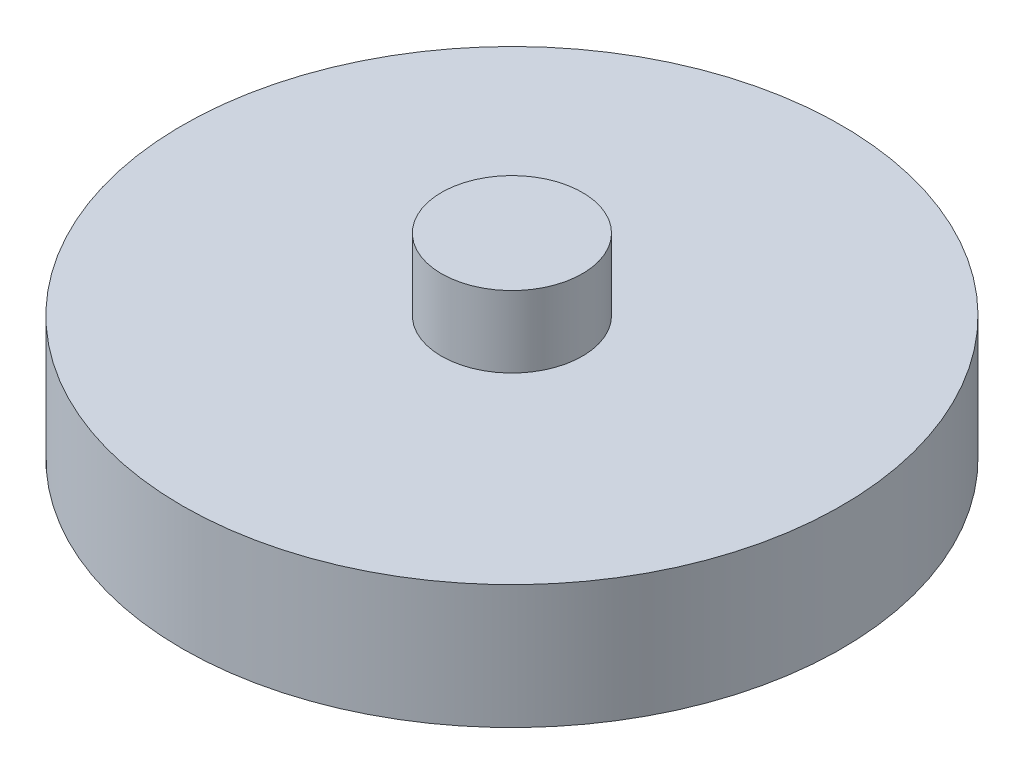
ISO-10303-21;
HEADER;
FILE_DESCRIPTION(('STEP AP214'),'2;1');
FILE_NAME('part.step','',(''),(''),'','','');
FILE_SCHEMA(('AUTOMOTIVE_DESIGN { 1 0 10303 214 1 1 1 1 }'));
ENDSEC;
DATA;
#1=APPLICATION_CONTEXT('core data for automotive mechanical design processes');
#2=APPLICATION_PROTOCOL_DEFINITION('international standard','automotive_design',2000,#1);
#3=PRODUCT_CONTEXT('',#1,'mechanical');
#4=PRODUCT('Part','Part','',(#3));
#5=PRODUCT_RELATED_PRODUCT_CATEGORY('part','',(#4));
#6=PRODUCT_DEFINITION_FORMATION('','',#4);
#7=PRODUCT_DEFINITION_CONTEXT('part definition',#1,'design');
#8=PRODUCT_DEFINITION('design','',#6,#7);
#9=PRODUCT_DEFINITION_SHAPE('','',#8);
#10=(LENGTH_UNIT() NAMED_UNIT(*) SI_UNIT(.MILLI.,.METRE.));
#11=(NAMED_UNIT(*) PLANE_ANGLE_UNIT() SI_UNIT($,.RADIAN.));
#12=(NAMED_UNIT(*) SI_UNIT($,.STERADIAN.) SOLID_ANGLE_UNIT());
#13=UNCERTAINTY_MEASURE_WITH_UNIT(LENGTH_MEASURE(1.E-05),#10,'distance_accuracy_value','');
#14=(GEOMETRIC_REPRESENTATION_CONTEXT(3) GLOBAL_UNCERTAINTY_ASSIGNED_CONTEXT((#13)) GLOBAL_UNIT_ASSIGNED_CONTEXT((#10,
#11,#12)) REPRESENTATION_CONTEXT('',''));
#15=CARTESIAN_POINT('',(0.,0.,0.));
#16=DIRECTION('',(0.,0.,1.));
#17=DIRECTION('',(1.,0.,0.));
#18=AXIS2_PLACEMENT_3D('',#15,#16,#17);
#19=CARTESIAN_POINT('',(0.,12.3,0.));
#20=DIRECTION('',(0.,1.,0.));
#21=DIRECTION('',(0.,0.,1.));
#22=AXIS2_PLACEMENT_3D('',#19,#20,#21);
#23=PLANE('',#22);
#24=CARTESIAN_POINT('',(0.,12.3,0.));
#25=DIRECTION('',(0.,1.,0.));
#26=DIRECTION('',(0.,0.,1.));
#27=AXIS2_PLACEMENT_3D('',#24,#25,#26);
#28=CIRCLE('',#27,32.75);
#29=CARTESIAN_POINT('',(0.,12.3,32.75));
#30=VERTEX_POINT('',#29);
#31=EDGE_CURVE('E10',#30,#30,#28,.T.);
#32=ORIENTED_EDGE('',*,*,#31,.T.);
#33=EDGE_LOOP('',(#32));
#34=FACE_BOUND('',#33,.T.);
#35=CARTESIAN_POINT('',(0.,12.3,0.));
#36=DIRECTION('',(0.,1.,0.));
#37=DIRECTION('',(0.,0.,1.));
#38=AXIS2_PLACEMENT_3D('',#35,#36,#37);
#39=CIRCLE('',#38,7.);
#40=CARTESIAN_POINT('',(0.,12.3,7.));
#41=VERTEX_POINT('',#40);
#42=EDGE_CURVE('E45',#41,#41,#39,.T.);
#43=ORIENTED_EDGE('',*,*,#42,.F.);
#44=EDGE_LOOP('',(#43));
#45=FACE_BOUND('',#44,.T.);
#46=ADVANCED_FACE('F32',(#34,#45),#23,.T.);
#47=CARTESIAN_POINT('',(0.,12.3,0.));
#48=DIRECTION('',(0.,-1.,0.));
#49=DIRECTION('',(0.,0.,-1.));
#50=AXIS2_PLACEMENT_3D('',#47,#48,#49);
#51=CYLINDRICAL_SURFACE('',#50,32.75);
#52=ORIENTED_EDGE('',*,*,#31,.F.);
#53=EDGE_LOOP('',(#52));
#54=FACE_BOUND('',#53,.T.);
#55=CARTESIAN_POINT('',(0.,0.,0.));
#56=DIRECTION('',(0.,1.,0.));
#57=DIRECTION('',(0.,0.,1.));
#58=AXIS2_PLACEMENT_3D('',#55,#56,#57);
#59=CIRCLE('',#58,32.75);
#60=CARTESIAN_POINT('',(0.,0.,32.75));
#61=VERTEX_POINT('',#60);
#62=EDGE_CURVE('E36',#61,#61,#59,.T.);
#63=ORIENTED_EDGE('',*,*,#62,.T.);
#64=EDGE_LOOP('',(#63));
#65=FACE_BOUND('',#64,.T.);
#66=ADVANCED_FACE('F34',(#54,#65),#51,.T.);
#67=CARTESIAN_POINT('',(0.,0.,0.));
#68=DIRECTION('',(0.,1.,0.));
#69=DIRECTION('',(0.,0.,1.));
#70=AXIS2_PLACEMENT_3D('',#67,#68,#69);
#71=PLANE('',#70);
#72=CARTESIAN_POINT('',(0.,0.,0.));
#73=DIRECTION('',(0.,-1.,0.));
#74=DIRECTION('',(0.,0.,-1.));
#75=AXIS2_PLACEMENT_3D('',#72,#73,#74);
#76=CIRCLE('',#75,25.);
#77=CARTESIAN_POINT('',(0.,0.,-25.));
#78=VERTEX_POINT('',#77);
#79=EDGE_CURVE('E51',#78,#78,#76,.T.);
#80=ORIENTED_EDGE('',*,*,#79,.F.);
#81=EDGE_LOOP('',(#80));
#82=FACE_BOUND('',#81,.T.);
#83=ORIENTED_EDGE('',*,*,#62,.F.);
#84=EDGE_LOOP('',(#83));
#85=FACE_BOUND('',#84,.T.);
#86=ADVANCED_FACE('F66',(#82,#85),#71,.F.);
#87=CARTESIAN_POINT('',(0.,19.4,0.));
#88=DIRECTION('',(0.,-1.,0.));
#89=DIRECTION('',(0.,0.,-1.));
#90=AXIS2_PLACEMENT_3D('',#87,#88,#89);
#91=CYLINDRICAL_SURFACE('',#90,7.);
#92=CARTESIAN_POINT('',(0.,19.4,0.));
#93=DIRECTION('',(0.,1.,0.));
#94=DIRECTION('',(0.,0.,1.));
#95=AXIS2_PLACEMENT_3D('',#92,#93,#94);
#96=CIRCLE('',#95,7.);
#97=CARTESIAN_POINT('',(0.,19.4,7.));
#98=VERTEX_POINT('',#97);
#99=EDGE_CURVE('E43',#98,#98,#96,.T.);
#100=ORIENTED_EDGE('',*,*,#99,.F.);
#101=EDGE_LOOP('',(#100));
#102=FACE_BOUND('',#101,.T.);
#103=ORIENTED_EDGE('',*,*,#42,.T.);
#104=EDGE_LOOP('',(#103));
#105=FACE_BOUND('',#104,.T.);
#106=ADVANCED_FACE('F69',(#102,#105),#91,.T.);
#107=CARTESIAN_POINT('',(0.,19.4,0.));
#108=DIRECTION('',(0.,1.,0.));
#109=DIRECTION('',(0.,0.,1.));
#110=AXIS2_PLACEMENT_3D('',#107,#108,#109);
#111=PLANE('',#110);
#112=ORIENTED_EDGE('',*,*,#99,.T.);
#113=EDGE_LOOP('',(#112));
#114=FACE_BOUND('',#113,.T.);
#115=ADVANCED_FACE('F62',(#114),#111,.T.);
#116=CARTESIAN_POINT('',(0.,3.,0.));
#117=DIRECTION('',(0.,-1.,0.));
#118=DIRECTION('',(0.,0.,-1.));
#119=AXIS2_PLACEMENT_3D('',#116,#117,#118);
#120=CYLINDRICAL_SURFACE('',#119,25.);
#121=CARTESIAN_POINT('',(0.,3.,0.));
#122=DIRECTION('',(0.,-1.,0.));
#123=DIRECTION('',(0.,0.,-1.));
#124=AXIS2_PLACEMENT_3D('',#121,#122,#123);
#125=CIRCLE('',#124,25.);
#126=CARTESIAN_POINT('',(0.,3.,-25.));
#127=VERTEX_POINT('',#126);
#128=EDGE_CURVE('E48',#127,#127,#125,.T.);
#129=ORIENTED_EDGE('',*,*,#128,.F.);
#130=EDGE_LOOP('',(#129));
#131=FACE_BOUND('',#130,.T.);
#132=ORIENTED_EDGE('',*,*,#79,.T.);
#133=EDGE_LOOP('',(#132));
#134=FACE_BOUND('',#133,.T.);
#135=ADVANCED_FACE('F59',(#131,#134),#120,.F.);
#136=CARTESIAN_POINT('',(0.,3.,0.));
#137=DIRECTION('',(0.,-1.,0.));
#138=DIRECTION('',(0.,0.,-1.));
#139=AXIS2_PLACEMENT_3D('',#136,#137,#138);
#140=PLANE('',#139);
#141=ORIENTED_EDGE('',*,*,#128,.T.);
#142=EDGE_LOOP('',(#141));
#143=FACE_BOUND('',#142,.T.);
#144=ADVANCED_FACE('F57',(#143),#140,.T.);
#145=CLOSED_SHELL('',(#46,#66,#86,#106,#115,#135,#144));
#146=MANIFOLD_SOLID_BREP('B2',#145);
#147=ADVANCED_BREP_SHAPE_REPRESENTATION('',(#18,#146),#14);
#148=SHAPE_DEFINITION_REPRESENTATION(#9,#147);
ENDSEC;
END-ISO-10303-21;
